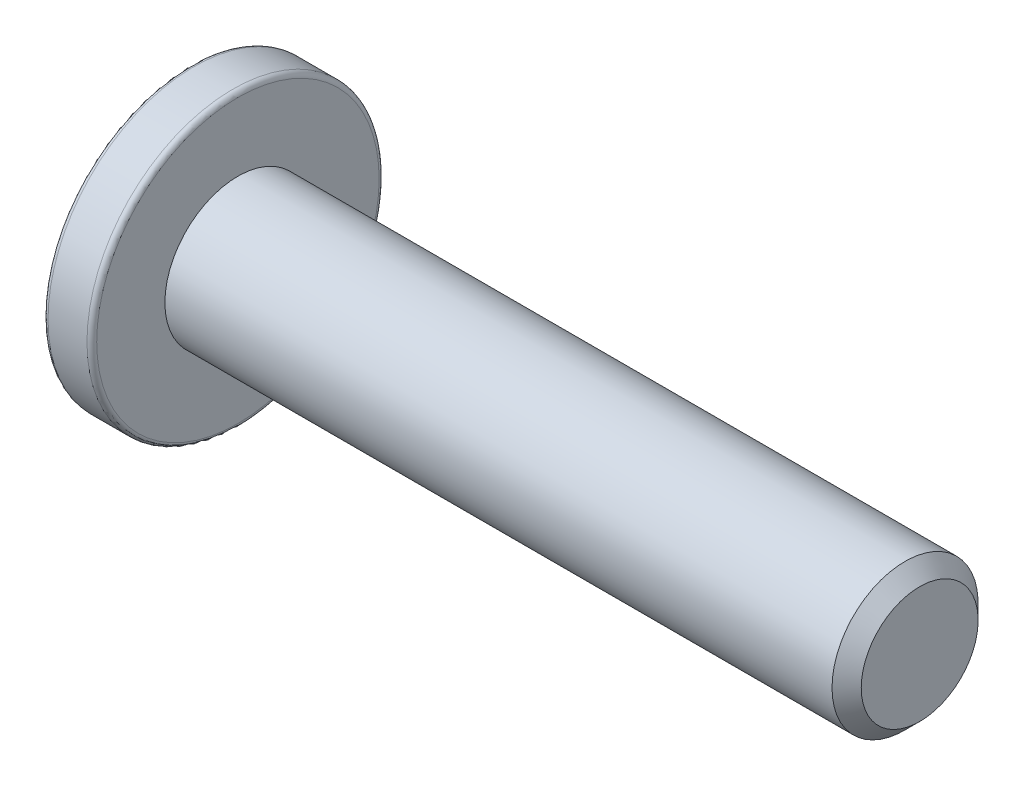
ISO-10303-21;
HEADER;
FILE_DESCRIPTION(('STEP AP214'),'2;1');
FILE_NAME('part.step','',(''),(''),'','','');
FILE_SCHEMA(('AUTOMOTIVE_DESIGN { 1 0 10303 214 1 1 1 1 }'));
ENDSEC;
DATA;
#1=APPLICATION_CONTEXT('core data for automotive mechanical design processes');
#2=APPLICATION_PROTOCOL_DEFINITION('international standard','automotive_design',2000,#1);
#3=PRODUCT_CONTEXT('',#1,'mechanical');
#4=PRODUCT('Part','Part','',(#3));
#5=PRODUCT_RELATED_PRODUCT_CATEGORY('part','',(#4));
#6=PRODUCT_DEFINITION_FORMATION('','',#4);
#7=PRODUCT_DEFINITION_CONTEXT('part definition',#1,'design');
#8=PRODUCT_DEFINITION('design','',#6,#7);
#9=PRODUCT_DEFINITION_SHAPE('','',#8);
#10=(LENGTH_UNIT() NAMED_UNIT(*) SI_UNIT(.MILLI.,.METRE.));
#11=(NAMED_UNIT(*) PLANE_ANGLE_UNIT() SI_UNIT($,.RADIAN.));
#12=(NAMED_UNIT(*) SI_UNIT($,.STERADIAN.) SOLID_ANGLE_UNIT());
#13=UNCERTAINTY_MEASURE_WITH_UNIT(LENGTH_MEASURE(1.E-05),#10,'distance_accuracy_value','');
#14=(GEOMETRIC_REPRESENTATION_CONTEXT(3) GLOBAL_UNCERTAINTY_ASSIGNED_CONTEXT((#13)) GLOBAL_UNIT_ASSIGNED_CONTEXT((#10,
#11,#12)) REPRESENTATION_CONTEXT('',''));
#15=CARTESIAN_POINT('',(0.,0.,0.));
#16=DIRECTION('',(0.,0.,1.));
#17=DIRECTION('',(1.,0.,0.));
#18=AXIS2_PLACEMENT_3D('',#15,#16,#17);
#19=CARTESIAN_POINT('',(14.,0.,0.));
#20=DIRECTION('',(-1.,0.,0.));
#21=DIRECTION('',(0.,0.,1.));
#22=AXIS2_PLACEMENT_3D('',#19,#20,#21);
#23=PLANE('',#22);
#24=CARTESIAN_POINT('',(14.,0.,0.));
#25=DIRECTION('',(-1.,0.,0.));
#26=DIRECTION('',(0.,0.,1.));
#27=AXIS2_PLACEMENT_3D('',#24,#25,#26);
#28=CIRCLE('',#27,1.2);
#29=CARTESIAN_POINT('',(14.,0.,1.2));
#30=VERTEX_POINT('',#29);
#31=EDGE_CURVE('E11',#30,#30,#28,.T.);
#32=ORIENTED_EDGE('',*,*,#31,.F.);
#33=EDGE_LOOP('',(#32));
#34=FACE_BOUND('',#33,.T.);
#35=ADVANCED_FACE('F44',(#34),#23,.F.);
#36=CARTESIAN_POINT('',(13.7,0.,0.));
#37=DIRECTION('',(-1.,0.,0.));
#38=DIRECTION('',(0.,0.,1.));
#39=AXIS2_PLACEMENT_3D('',#36,#37,#38);
#40=CONICAL_SURFACE('',#39,1.5,0.785398163397451);
#41=ORIENTED_EDGE('',*,*,#31,.T.);
#42=EDGE_LOOP('',(#41));
#43=FACE_BOUND('',#42,.T.);
#44=CARTESIAN_POINT('',(13.7,0.,0.));
#45=DIRECTION('',(-1.,0.,0.));
#46=DIRECTION('',(0.,0.,1.));
#47=AXIS2_PLACEMENT_3D('',#44,#45,#46);
#48=CIRCLE('',#47,1.5);
#49=CARTESIAN_POINT('',(13.7,0.,1.5));
#50=VERTEX_POINT('',#49);
#51=EDGE_CURVE('E55',#50,#50,#48,.T.);
#52=ORIENTED_EDGE('',*,*,#51,.F.);
#53=EDGE_LOOP('',(#52));
#54=FACE_BOUND('',#53,.T.);
#55=ADVANCED_FACE('F174',(#43,#54),#40,.T.);
#56=CARTESIAN_POINT('',(0.,0.,0.));
#57=DIRECTION('',(-1.,0.,0.));
#58=DIRECTION('',(0.,0.,1.));
#59=AXIS2_PLACEMENT_3D('',#56,#57,#58);
#60=CYLINDRICAL_SURFACE('',#59,1.5);
#61=ORIENTED_EDGE('',*,*,#51,.T.);
#62=EDGE_LOOP('',(#61));
#63=FACE_BOUND('',#62,.T.);
#64=CARTESIAN_POINT('',(0.,0.,0.));
#65=DIRECTION('',(-1.,0.,0.));
#66=DIRECTION('',(0.,0.,1.));
#67=AXIS2_PLACEMENT_3D('',#64,#65,#66);
#68=CIRCLE('',#67,1.5);
#69=CARTESIAN_POINT('',(0.,0.,1.5));
#70=VERTEX_POINT('',#69);
#71=EDGE_CURVE('E162',#70,#70,#68,.T.);
#72=ORIENTED_EDGE('',*,*,#71,.F.);
#73=EDGE_LOOP('',(#72));
#74=FACE_BOUND('',#73,.T.);
#75=ADVANCED_FACE('F169',(#63,#74),#60,.T.);
#76=CARTESIAN_POINT('',(0.,0.,0.));
#77=DIRECTION('',(-1.,0.,0.));
#78=DIRECTION('',(0.,0.,1.));
#79=AXIS2_PLACEMENT_3D('',#76,#77,#78);
#80=PLANE('',#79);
#81=CARTESIAN_POINT('',(0.,0.,0.));
#82=DIRECTION('',(-1.,0.,0.));
#83=DIRECTION('',(0.,0.,1.));
#84=AXIS2_PLACEMENT_3D('',#81,#82,#83);
#85=CIRCLE('',#84,2.9);
#86=CARTESIAN_POINT('',(0.,0.,2.9));
#87=VERTEX_POINT('',#86);
#88=EDGE_CURVE('E159',#87,#87,#85,.T.);
#89=ORIENTED_EDGE('',*,*,#88,.F.);
#90=EDGE_LOOP('',(#89));
#91=FACE_BOUND('',#90,.T.);
#92=ORIENTED_EDGE('',*,*,#71,.T.);
#93=EDGE_LOOP('',(#92));
#94=FACE_BOUND('',#93,.T.);
#95=ADVANCED_FACE('F180',(#91,#94),#80,.F.);
#96=CARTESIAN_POINT('',(-0.1,0.,0.));
#97=DIRECTION('',(-1.,0.,0.));
#98=DIRECTION('',(0.,0.,1.));
#99=AXIS2_PLACEMENT_3D('',#96,#97,#98);
#100=TOROIDAL_SURFACE('',#99,2.9,0.0999999999999997);
#101=CARTESIAN_POINT('',(-0.1,0.,0.));
#102=DIRECTION('',(-1.,0.,0.));
#103=DIRECTION('',(0.,0.,1.));
#104=AXIS2_PLACEMENT_3D('',#101,#102,#103);
#105=CIRCLE('',#104,3.);
#106=CARTESIAN_POINT('',(-0.1,0.,3.));
#107=VERTEX_POINT('',#106);
#108=EDGE_CURVE('E160',#107,#107,#105,.T.);
#109=ORIENTED_EDGE('',*,*,#108,.F.);
#110=EDGE_LOOP('',(#109));
#111=FACE_BOUND('',#110,.T.);
#112=ORIENTED_EDGE('',*,*,#88,.T.);
#113=EDGE_LOOP('',(#112));
#114=FACE_BOUND('',#113,.T.);
#115=ADVANCED_FACE('F183',(#111,#114),#100,.T.);
#116=CARTESIAN_POINT('',(0.,0.,0.));
#117=DIRECTION('',(-1.,0.,0.));
#118=DIRECTION('',(0.,0.,1.));
#119=AXIS2_PLACEMENT_3D('',#116,#117,#118);
#120=CYLINDRICAL_SURFACE('',#119,3.);
#121=CARTESIAN_POINT('',(-0.9,0.,0.));
#122=DIRECTION('',(-1.,0.,0.));
#123=DIRECTION('',(0.,0.,1.));
#124=AXIS2_PLACEMENT_3D('',#121,#122,#123);
#125=CIRCLE('',#124,3.);
#126=CARTESIAN_POINT('',(-0.9,0.,3.));
#127=VERTEX_POINT('',#126);
#128=EDGE_CURVE('E152',#127,#127,#125,.T.);
#129=ORIENTED_EDGE('',*,*,#128,.F.);
#130=EDGE_LOOP('',(#129));
#131=FACE_BOUND('',#130,.T.);
#132=ORIENTED_EDGE('',*,*,#108,.T.);
#133=EDGE_LOOP('',(#132));
#134=FACE_BOUND('',#133,.T.);
#135=ADVANCED_FACE('F188',(#131,#134),#120,.T.);
#136=CARTESIAN_POINT('',(-0.9,0.,0.));
#137=DIRECTION('',(-1.,0.,0.));
#138=DIRECTION('',(0.,0.,1.));
#139=AXIS2_PLACEMENT_3D('',#136,#137,#138);
#140=TOROIDAL_SURFACE('',#139,2.9,0.1);
#141=CARTESIAN_POINT('',(-1.,0.,0.));
#142=DIRECTION('',(-1.,0.,0.));
#143=DIRECTION('',(0.,0.,1.));
#144=AXIS2_PLACEMENT_3D('',#141,#142,#143);
#145=CIRCLE('',#144,2.9);
#146=CARTESIAN_POINT('',(-1.,0.,2.9));
#147=VERTEX_POINT('',#146);
#148=EDGE_CURVE('E148',#147,#147,#145,.T.);
#149=ORIENTED_EDGE('',*,*,#148,.F.);
#150=EDGE_LOOP('',(#149));
#151=FACE_BOUND('',#150,.T.);
#152=ORIENTED_EDGE('',*,*,#128,.T.);
#153=EDGE_LOOP('',(#152));
#154=FACE_BOUND('',#153,.T.);
#155=ADVANCED_FACE('F192',(#151,#154),#140,.T.);
#156=CARTESIAN_POINT('',(-1.,0.,0.));
#157=DIRECTION('',(-1.,0.,0.));
#158=DIRECTION('',(0.,0.,1.));
#159=AXIS2_PLACEMENT_3D('',#156,#157,#158);
#160=PLANE('',#159);
#161=DIRECTION('',(0.,0.5,0.866025403784439));
#162=VECTOR('',#161,1.);
#163=CARTESIAN_POINT('',(-1.,-1.15470053837925,0.));
#164=LINE('',#163,#162);
#165=CARTESIAN_POINT('',(-1.,-1.15470053837925,0.));
#166=VERTEX_POINT('',#165);
#167=CARTESIAN_POINT('',(-1.,-0.577350269189626,1.));
#168=VERTEX_POINT('',#167);
#169=EDGE_CURVE('E56',#166,#168,#164,.T.);
#170=ORIENTED_EDGE('',*,*,#169,.F.);
#171=DIRECTION('',(0.,-0.5,0.866025403784438));
#172=VECTOR('',#171,1.);
#173=CARTESIAN_POINT('',(-1.,-0.577350269189626,-1.));
#174=LINE('',#173,#172);
#175=CARTESIAN_POINT('',(-1.,-0.577350269189626,-1.));
#176=VERTEX_POINT('',#175);
#177=EDGE_CURVE('E142',#176,#166,#174,.T.);
#178=ORIENTED_EDGE('',*,*,#177,.F.);
#179=DIRECTION('',(0.,-1.,0.));
#180=VECTOR('',#179,1.);
#181=CARTESIAN_POINT('',(-1.,0.577350269189626,-1.));
#182=LINE('',#181,#180);
#183=CARTESIAN_POINT('',(-1.,0.577350269189626,-1.));
#184=VERTEX_POINT('',#183);
#185=EDGE_CURVE('E136',#184,#176,#182,.T.);
#186=ORIENTED_EDGE('',*,*,#185,.F.);
#187=DIRECTION('',(0.,-0.5,-0.866025403784439));
#188=VECTOR('',#187,1.);
#189=CARTESIAN_POINT('',(-1.,1.15470053837925,0.));
#190=LINE('',#189,#188);
#191=CARTESIAN_POINT('',(-1.,1.15470053837925,0.));
#192=VERTEX_POINT('',#191);
#193=EDGE_CURVE('E110',#192,#184,#190,.T.);
#194=ORIENTED_EDGE('',*,*,#193,.F.);
#195=DIRECTION('',(0.,0.5,-0.866025403784439));
#196=VECTOR('',#195,1.);
#197=CARTESIAN_POINT('',(-1.,0.577350269189626,1.));
#198=LINE('',#197,#196);
#199=CARTESIAN_POINT('',(-1.,0.577350269189626,1.));
#200=VERTEX_POINT('',#199);
#201=EDGE_CURVE('E138',#200,#192,#198,.T.);
#202=ORIENTED_EDGE('',*,*,#201,.F.);
#203=DIRECTION('',(0.,1.,0.));
#204=VECTOR('',#203,1.);
#205=CARTESIAN_POINT('',(-1.,-0.577350269189626,1.));
#206=LINE('',#205,#204);
#207=EDGE_CURVE('E135',#168,#200,#206,.T.);
#208=ORIENTED_EDGE('',*,*,#207,.F.);
#209=EDGE_LOOP('',(#170,#178,#186,#194,#202,#208));
#210=FACE_BOUND('',#209,.T.);
#211=ORIENTED_EDGE('',*,*,#148,.T.);
#212=EDGE_LOOP('',(#211));
#213=FACE_BOUND('',#212,.T.);
#214=ADVANCED_FACE('F197',(#210,#213),#160,.T.);
#215=CARTESIAN_POINT('',(-0.5,-1.15470053837925,0.));
#216=DIRECTION('',(0.,-0.866025403784439,0.5));
#217=DIRECTION('',(0.,-0.5,-0.866025403784439));
#218=AXIS2_PLACEMENT_3D('',#215,#216,#217);
#219=PLANE('',#218);
#220=ORIENTED_EDGE('',*,*,#169,.T.);
#221=DIRECTION('',(-1.,0.,0.));
#222=VECTOR('',#221,1.);
#223=CARTESIAN_POINT('',(-0.5,-0.577350269189626,1.));
#224=LINE('',#223,#222);
#225=CARTESIAN_POINT('',(-0.5,-0.577350269189626,1.));
#226=VERTEX_POINT('',#225);
#227=EDGE_CURVE('E90',#226,#168,#224,.T.);
#228=ORIENTED_EDGE('',*,*,#227,.F.);
#229=DIRECTION('',(0.,0.5,0.866025403784439));
#230=VECTOR('',#229,1.);
#231=CARTESIAN_POINT('',(-0.5,-1.15470053837925,0.));
#232=LINE('',#231,#230);
#233=CARTESIAN_POINT('',(-0.5,-1.15470053837925,0.));
#234=VERTEX_POINT('',#233);
#235=EDGE_CURVE('E145',#234,#226,#232,.T.);
#236=ORIENTED_EDGE('',*,*,#235,.F.);
#237=DIRECTION('',(-1.,0.,0.));
#238=VECTOR('',#237,1.);
#239=CARTESIAN_POINT('',(-0.5,-1.15470053837925,0.));
#240=LINE('',#239,#238);
#241=EDGE_CURVE('E69',#234,#166,#240,.T.);
#242=ORIENTED_EDGE('',*,*,#241,.T.);
#243=EDGE_LOOP('',(#220,#228,#236,#242));
#244=FACE_BOUND('',#243,.T.);
#245=ADVANCED_FACE('F203',(#244),#219,.F.);
#246=CARTESIAN_POINT('',(-0.5,-0.577350269189626,-1.));
#247=DIRECTION('',(0.,-0.866025403784439,-0.5));
#248=DIRECTION('',(0.,0.5,-0.866025403784438));
#249=AXIS2_PLACEMENT_3D('',#246,#247,#248);
#250=PLANE('',#249);
#251=ORIENTED_EDGE('',*,*,#177,.T.);
#252=ORIENTED_EDGE('',*,*,#241,.F.);
#253=DIRECTION('',(0.,-0.5,0.866025403784438));
#254=VECTOR('',#253,1.);
#255=CARTESIAN_POINT('',(-0.5,-0.577350269189626,-1.));
#256=LINE('',#255,#254);
#257=CARTESIAN_POINT('',(-0.5,-0.577350269189626,-1.));
#258=VERTEX_POINT('',#257);
#259=EDGE_CURVE('E118',#258,#234,#256,.T.);
#260=ORIENTED_EDGE('',*,*,#259,.F.);
#261=DIRECTION('',(-1.,0.,0.));
#262=VECTOR('',#261,1.);
#263=CARTESIAN_POINT('',(-0.5,-0.577350269189626,-1.));
#264=LINE('',#263,#262);
#265=EDGE_CURVE('E112',#258,#176,#264,.T.);
#266=ORIENTED_EDGE('',*,*,#265,.T.);
#267=EDGE_LOOP('',(#251,#252,#260,#266));
#268=FACE_BOUND('',#267,.T.);
#269=ADVANCED_FACE('F202',(#268),#250,.F.);
#270=CARTESIAN_POINT('',(-0.5,0.577350269189626,-1.));
#271=DIRECTION('',(0.,0.,-1.));
#272=DIRECTION('',(-1.,0.,0.));
#273=AXIS2_PLACEMENT_3D('',#270,#271,#272);
#274=PLANE('',#273);
#275=ORIENTED_EDGE('',*,*,#185,.T.);
#276=ORIENTED_EDGE('',*,*,#265,.F.);
#277=DIRECTION('',(0.,-1.,0.));
#278=VECTOR('',#277,1.);
#279=CARTESIAN_POINT('',(-0.5,0.577350269189626,-1.));
#280=LINE('',#279,#278);
#281=CARTESIAN_POINT('',(-0.5,0.577350269189626,-1.));
#282=VERTEX_POINT('',#281);
#283=EDGE_CURVE('E113',#282,#258,#280,.T.);
#284=ORIENTED_EDGE('',*,*,#283,.F.);
#285=DIRECTION('',(-1.,0.,0.));
#286=VECTOR('',#285,1.);
#287=CARTESIAN_POINT('',(-0.5,0.577350269189626,-1.));
#288=LINE('',#287,#286);
#289=EDGE_CURVE('E99',#282,#184,#288,.T.);
#290=ORIENTED_EDGE('',*,*,#289,.T.);
#291=EDGE_LOOP('',(#275,#276,#284,#290));
#292=FACE_BOUND('',#291,.T.);
#293=ADVANCED_FACE('F119',(#292),#274,.F.);
#294=CARTESIAN_POINT('',(-0.5,1.15470053837925,0.));
#295=DIRECTION('',(0.,0.866025403784439,-0.5));
#296=DIRECTION('',(0.,0.5,0.866025403784439));
#297=AXIS2_PLACEMENT_3D('',#294,#295,#296);
#298=PLANE('',#297);
#299=ORIENTED_EDGE('',*,*,#193,.T.);
#300=ORIENTED_EDGE('',*,*,#289,.F.);
#301=DIRECTION('',(0.,-0.5,-0.866025403784439));
#302=VECTOR('',#301,1.);
#303=CARTESIAN_POINT('',(-0.5,1.15470053837925,0.));
#304=LINE('',#303,#302);
#305=CARTESIAN_POINT('',(-0.5,1.15470053837925,0.));
#306=VERTEX_POINT('',#305);
#307=EDGE_CURVE('E102',#306,#282,#304,.T.);
#308=ORIENTED_EDGE('',*,*,#307,.F.);
#309=DIRECTION('',(-1.,0.,0.));
#310=VECTOR('',#309,1.);
#311=CARTESIAN_POINT('',(-0.5,1.15470053837925,0.));
#312=LINE('',#311,#310);
#313=EDGE_CURVE('E115',#306,#192,#312,.T.);
#314=ORIENTED_EDGE('',*,*,#313,.T.);
#315=EDGE_LOOP('',(#299,#300,#308,#314));
#316=FACE_BOUND('',#315,.T.);
#317=ADVANCED_FACE('F105',(#316),#298,.F.);
#318=CARTESIAN_POINT('',(-0.5,0.577350269189626,1.));
#319=DIRECTION('',(0.,0.866025403784439,0.5));
#320=DIRECTION('',(0.,-0.5,0.866025403784439));
#321=AXIS2_PLACEMENT_3D('',#318,#319,#320);
#322=PLANE('',#321);
#323=ORIENTED_EDGE('',*,*,#201,.T.);
#324=ORIENTED_EDGE('',*,*,#313,.F.);
#325=DIRECTION('',(0.,0.5,-0.866025403784439));
#326=VECTOR('',#325,1.);
#327=CARTESIAN_POINT('',(-0.5,0.577350269189626,1.));
#328=LINE('',#327,#326);
#329=CARTESIAN_POINT('',(-0.5,0.577350269189626,1.));
#330=VERTEX_POINT('',#329);
#331=EDGE_CURVE('E121',#330,#306,#328,.T.);
#332=ORIENTED_EDGE('',*,*,#331,.F.);
#333=DIRECTION('',(-1.,0.,0.));
#334=VECTOR('',#333,1.);
#335=CARTESIAN_POINT('',(-0.5,0.577350269189626,1.));
#336=LINE('',#335,#334);
#337=EDGE_CURVE('E149',#330,#200,#336,.T.);
#338=ORIENTED_EDGE('',*,*,#337,.T.);
#339=EDGE_LOOP('',(#323,#324,#332,#338));
#340=FACE_BOUND('',#339,.T.);
#341=ADVANCED_FACE('F207',(#340),#322,.F.);
#342=CARTESIAN_POINT('',(-0.5,-0.577350269189626,1.));
#343=DIRECTION('',(0.,0.,1.));
#344=DIRECTION('',(1.,0.,0.));
#345=AXIS2_PLACEMENT_3D('',#342,#343,#344);
#346=PLANE('',#345);
#347=ORIENTED_EDGE('',*,*,#207,.T.);
#348=ORIENTED_EDGE('',*,*,#337,.F.);
#349=DIRECTION('',(0.,1.,0.));
#350=VECTOR('',#349,1.);
#351=CARTESIAN_POINT('',(-0.5,-0.577350269189626,1.));
#352=LINE('',#351,#350);
#353=EDGE_CURVE('E130',#226,#330,#352,.T.);
#354=ORIENTED_EDGE('',*,*,#353,.F.);
#355=ORIENTED_EDGE('',*,*,#227,.T.);
#356=EDGE_LOOP('',(#347,#348,#354,#355));
#357=FACE_BOUND('',#356,.T.);
#358=ADVANCED_FACE('F206',(#357),#346,.F.);
#359=CARTESIAN_POINT('',(-0.5,0.,0.));
#360=DIRECTION('',(-1.,0.,0.));
#361=DIRECTION('',(0.,0.,1.));
#362=AXIS2_PLACEMENT_3D('',#359,#360,#361);
#363=PLANE('',#362);
#364=ORIENTED_EDGE('',*,*,#235,.T.);
#365=ORIENTED_EDGE('',*,*,#353,.T.);
#366=ORIENTED_EDGE('',*,*,#331,.T.);
#367=ORIENTED_EDGE('',*,*,#307,.T.);
#368=ORIENTED_EDGE('',*,*,#283,.T.);
#369=ORIENTED_EDGE('',*,*,#259,.T.);
#370=EDGE_LOOP('',(#364,#365,#366,#367,#368,#369));
#371=FACE_BOUND('',#370,.T.);
#372=ADVANCED_FACE('F124',(#371),#363,.T.);
#373=CLOSED_SHELL('',(#35,#55,#75,#95,#115,#135,#155,#214,#245,#269,#293,#317,#341,#358,#372));
#374=MANIFOLD_SOLID_BREP('B2',#373);
#375=ADVANCED_BREP_SHAPE_REPRESENTATION('',(#18,#374),#14);
#376=SHAPE_DEFINITION_REPRESENTATION(#9,#375);
ENDSEC;
END-ISO-10303-21;
